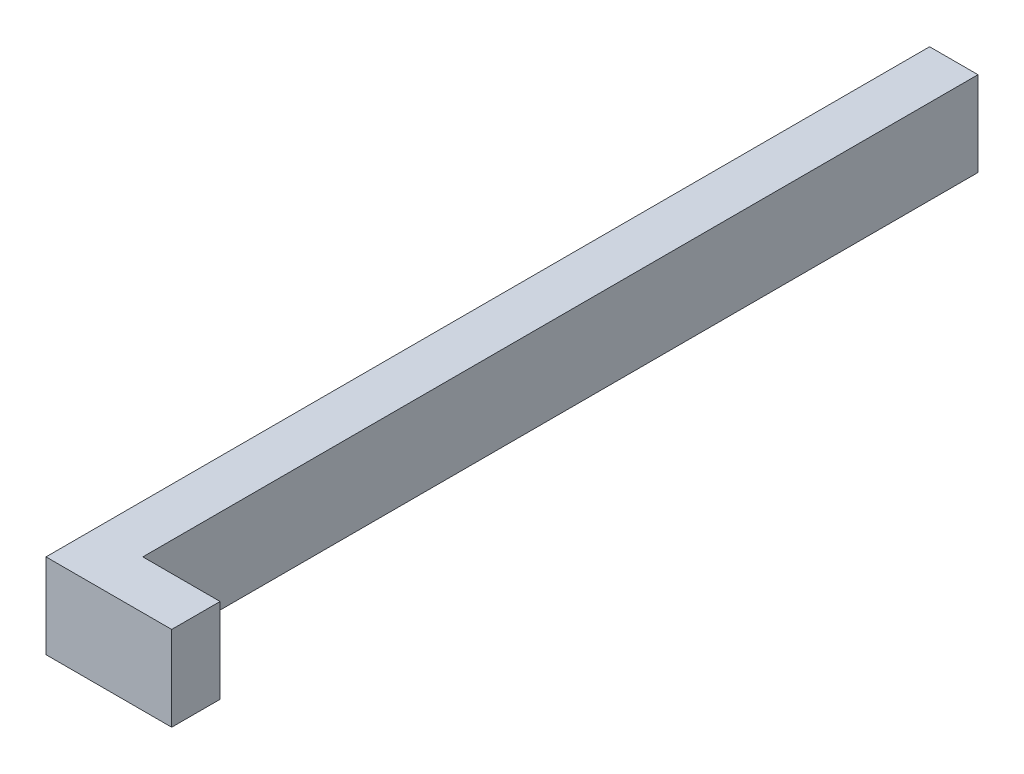
ISO-10303-21;
HEADER;
FILE_DESCRIPTION(('STEP AP214'),'2;1');
FILE_NAME('part.step','',(''),(''),'','','');
FILE_SCHEMA(('AUTOMOTIVE_DESIGN { 1 0 10303 214 1 1 1 1 }'));
ENDSEC;
DATA;
#1=APPLICATION_CONTEXT('core data for automotive mechanical design processes');
#2=APPLICATION_PROTOCOL_DEFINITION('international standard','automotive_design',2000,#1);
#3=PRODUCT_CONTEXT('',#1,'mechanical');
#4=PRODUCT('Part','Part','',(#3));
#5=PRODUCT_RELATED_PRODUCT_CATEGORY('part','',(#4));
#6=PRODUCT_DEFINITION_FORMATION('','',#4);
#7=PRODUCT_DEFINITION_CONTEXT('part definition',#1,'design');
#8=PRODUCT_DEFINITION('design','',#6,#7);
#9=PRODUCT_DEFINITION_SHAPE('','',#8);
#10=(LENGTH_UNIT() NAMED_UNIT(*) SI_UNIT(.MILLI.,.METRE.));
#11=(NAMED_UNIT(*) PLANE_ANGLE_UNIT() SI_UNIT($,.RADIAN.));
#12=(NAMED_UNIT(*) SI_UNIT($,.STERADIAN.) SOLID_ANGLE_UNIT());
#13=UNCERTAINTY_MEASURE_WITH_UNIT(LENGTH_MEASURE(1.E-05),#10,'distance_accuracy_value','');
#14=(GEOMETRIC_REPRESENTATION_CONTEXT(3) GLOBAL_UNCERTAINTY_ASSIGNED_CONTEXT((#13)) GLOBAL_UNIT_ASSIGNED_CONTEXT((#10,
#11,#12)) REPRESENTATION_CONTEXT('',''));
#15=CARTESIAN_POINT('',(0.,0.,0.));
#16=DIRECTION('',(0.,0.,1.));
#17=DIRECTION('',(1.,0.,0.));
#18=AXIS2_PLACEMENT_3D('',#15,#16,#17);
#19=CARTESIAN_POINT('',(-58.,8.5,-67.));
#20=DIRECTION('',(0.,0.,-1.));
#21=DIRECTION('',(-1.,0.,0.));
#22=AXIS2_PLACEMENT_3D('',#19,#20,#21);
#23=PLANE('',#22);
#24=DIRECTION('',(1.,0.,0.));
#25=VECTOR('',#24,1.);
#26=CARTESIAN_POINT('',(-58.,1.5,-67.));
#27=LINE('',#26,#25);
#28=CARTESIAN_POINT('',(-58.,1.5,-67.));
#29=VERTEX_POINT('',#28);
#30=CARTESIAN_POINT('',(-47.6158676579824,1.5,-67.));
#31=VERTEX_POINT('',#30);
#32=EDGE_CURVE('E142',#29,#31,#27,.T.);
#33=ORIENTED_EDGE('',*,*,#32,.T.);
#34=DIRECTION('',(0.,-1.,0.));
#35=VECTOR('',#34,1.);
#36=CARTESIAN_POINT('',(-47.6158676579824,8.5,-67.));
#37=LINE('',#36,#35);
#38=CARTESIAN_POINT('',(-47.6158676579824,8.5,-67.));
#39=VERTEX_POINT('',#38);
#40=EDGE_CURVE('E122',#39,#31,#37,.T.);
#41=ORIENTED_EDGE('',*,*,#40,.F.);
#42=DIRECTION('',(1.,0.,0.));
#43=VECTOR('',#42,1.);
#44=CARTESIAN_POINT('',(-58.,8.5,-67.));
#45=LINE('',#44,#43);
#46=CARTESIAN_POINT('',(-58.,8.5,-67.));
#47=VERTEX_POINT('',#46);
#48=EDGE_CURVE('E132',#47,#39,#45,.T.);
#49=ORIENTED_EDGE('',*,*,#48,.F.);
#50=DIRECTION('',(0.,-1.,0.));
#51=VECTOR('',#50,1.);
#52=CARTESIAN_POINT('',(-58.,8.5,-67.));
#53=LINE('',#52,#51);
#54=EDGE_CURVE('E125',#47,#29,#53,.T.);
#55=ORIENTED_EDGE('',*,*,#54,.T.);
#56=EDGE_LOOP('',(#33,#41,#49,#55));
#57=FACE_BOUND('',#56,.T.);
#58=ADVANCED_FACE('F45',(#57),#23,.F.);
#59=CARTESIAN_POINT('',(-47.6158676579824,8.5,-67.));
#60=DIRECTION('',(-1.,0.,0.));
#61=DIRECTION('',(0.,0.,1.));
#62=AXIS2_PLACEMENT_3D('',#59,#60,#61);
#63=PLANE('',#62);
#64=DIRECTION('',(0.,0.,-1.));
#65=VECTOR('',#64,1.);
#66=CARTESIAN_POINT('',(-47.6158676579824,1.5,-67.));
#67=LINE('',#66,#65);
#68=CARTESIAN_POINT('',(-47.6158676579824,1.5,-71.));
#69=VERTEX_POINT('',#68);
#70=EDGE_CURVE('E145',#31,#69,#67,.T.);
#71=ORIENTED_EDGE('',*,*,#70,.T.);
#72=DIRECTION('',(0.,-1.,0.));
#73=VECTOR('',#72,1.);
#74=CARTESIAN_POINT('',(-47.6158676579824,8.5,-71.));
#75=LINE('',#74,#73);
#76=CARTESIAN_POINT('',(-47.6158676579824,8.5,-71.));
#77=VERTEX_POINT('',#76);
#78=EDGE_CURVE('E114',#77,#69,#75,.T.);
#79=ORIENTED_EDGE('',*,*,#78,.F.);
#80=DIRECTION('',(0.,0.,-1.));
#81=VECTOR('',#80,1.);
#82=CARTESIAN_POINT('',(-47.6158676579824,8.5,-67.));
#83=LINE('',#82,#81);
#84=EDGE_CURVE('E138',#39,#77,#83,.T.);
#85=ORIENTED_EDGE('',*,*,#84,.F.);
#86=ORIENTED_EDGE('',*,*,#40,.T.);
#87=EDGE_LOOP('',(#71,#79,#85,#86));
#88=FACE_BOUND('',#87,.T.);
#89=ADVANCED_FACE('F152',(#88),#63,.F.);
#90=CARTESIAN_POINT('',(-47.6158676579824,8.5,-71.));
#91=DIRECTION('',(0.,0.,1.));
#92=DIRECTION('',(1.,0.,0.));
#93=AXIS2_PLACEMENT_3D('',#90,#91,#92);
#94=PLANE('',#93);
#95=DIRECTION('',(-1.,0.,0.));
#96=VECTOR('',#95,1.);
#97=CARTESIAN_POINT('',(-47.6158676579824,1.5,-71.));
#98=LINE('',#97,#96);
#99=CARTESIAN_POINT('',(-54.,1.5,-71.));
#100=VERTEX_POINT('',#99);
#101=EDGE_CURVE('E111',#69,#100,#98,.T.);
#102=ORIENTED_EDGE('',*,*,#101,.T.);
#103=DIRECTION('',(0.,-1.,0.));
#104=VECTOR('',#103,1.);
#105=CARTESIAN_POINT('',(-54.,8.5,-71.));
#106=LINE('',#105,#104);
#107=CARTESIAN_POINT('',(-54.,8.5,-71.));
#108=VERTEX_POINT('',#107);
#109=EDGE_CURVE('E109',#108,#100,#106,.T.);
#110=ORIENTED_EDGE('',*,*,#109,.F.);
#111=DIRECTION('',(-1.,0.,0.));
#112=VECTOR('',#111,1.);
#113=CARTESIAN_POINT('',(-47.6158676579824,8.5,-71.));
#114=LINE('',#113,#112);
#115=EDGE_CURVE('E116',#77,#108,#114,.T.);
#116=ORIENTED_EDGE('',*,*,#115,.F.);
#117=ORIENTED_EDGE('',*,*,#78,.T.);
#118=EDGE_LOOP('',(#102,#110,#116,#117));
#119=FACE_BOUND('',#118,.T.);
#120=ADVANCED_FACE('F148',(#119),#94,.F.);
#121=CARTESIAN_POINT('',(-54.,8.5,-71.));
#122=DIRECTION('',(-1.,0.,0.));
#123=DIRECTION('',(0.,0.,1.));
#124=AXIS2_PLACEMENT_3D('',#121,#122,#123);
#125=PLANE('',#124);
#126=DIRECTION('',(0.,0.,-1.));
#127=VECTOR('',#126,1.);
#128=CARTESIAN_POINT('',(-54.,1.5,-71.));
#129=LINE('',#128,#127);
#130=CARTESIAN_POINT('',(-54.,1.5,-140.));
#131=VERTEX_POINT('',#130);
#132=EDGE_CURVE('E95',#100,#131,#129,.T.);
#133=ORIENTED_EDGE('',*,*,#132,.T.);
#134=DIRECTION('',(0.,-1.,0.));
#135=VECTOR('',#134,1.);
#136=CARTESIAN_POINT('',(-54.,8.5,-140.));
#137=LINE('',#136,#135);
#138=CARTESIAN_POINT('',(-54.,8.5,-140.));
#139=VERTEX_POINT('',#138);
#140=EDGE_CURVE('E106',#139,#131,#137,.T.);
#141=ORIENTED_EDGE('',*,*,#140,.F.);
#142=DIRECTION('',(0.,0.,-1.));
#143=VECTOR('',#142,1.);
#144=CARTESIAN_POINT('',(-54.,8.5,-71.));
#145=LINE('',#144,#143);
#146=EDGE_CURVE('E61',#108,#139,#145,.T.);
#147=ORIENTED_EDGE('',*,*,#146,.F.);
#148=ORIENTED_EDGE('',*,*,#109,.T.);
#149=EDGE_LOOP('',(#133,#141,#147,#148));
#150=FACE_BOUND('',#149,.T.);
#151=ADVANCED_FACE('F105',(#150),#125,.F.);
#152=CARTESIAN_POINT('',(0.,8.5,0.));
#153=DIRECTION('',(0.,1.,0.));
#154=DIRECTION('',(0.,0.,1.));
#155=AXIS2_PLACEMENT_3D('',#152,#153,#154);
#156=PLANE('',#155);
#157=DIRECTION('',(-1.,0.,0.));
#158=VECTOR('',#157,1.);
#159=CARTESIAN_POINT('',(-54.,8.5,-140.));
#160=LINE('',#159,#158);
#161=CARTESIAN_POINT('',(-58.,8.5,-140.));
#162=VERTEX_POINT('',#161);
#163=EDGE_CURVE('E110',#139,#162,#160,.T.);
#164=ORIENTED_EDGE('',*,*,#163,.T.);
#165=DIRECTION('',(0.,0.,1.));
#166=VECTOR('',#165,1.);
#167=CARTESIAN_POINT('',(-58.,8.5,-140.));
#168=LINE('',#167,#166);
#169=EDGE_CURVE('E130',#162,#47,#168,.T.);
#170=ORIENTED_EDGE('',*,*,#169,.T.);
#171=ORIENTED_EDGE('',*,*,#48,.T.);
#172=ORIENTED_EDGE('',*,*,#84,.T.);
#173=ORIENTED_EDGE('',*,*,#115,.T.);
#174=ORIENTED_EDGE('',*,*,#146,.T.);
#175=EDGE_LOOP('',(#164,#170,#171,#172,#173,#174));
#176=FACE_BOUND('',#175,.T.);
#177=ADVANCED_FACE('F134',(#176),#156,.T.);
#178=CARTESIAN_POINT('',(-58.,8.5,-140.));
#179=DIRECTION('',(1.,0.,0.));
#180=DIRECTION('',(0.,0.,-1.));
#181=AXIS2_PLACEMENT_3D('',#178,#179,#180);
#182=PLANE('',#181);
#183=DIRECTION('',(0.,0.,1.));
#184=VECTOR('',#183,1.);
#185=CARTESIAN_POINT('',(-58.,1.5,-140.));
#186=LINE('',#185,#184);
#187=CARTESIAN_POINT('',(-58.,1.5,-140.));
#188=VERTEX_POINT('',#187);
#189=EDGE_CURVE('E98',#188,#29,#186,.T.);
#190=ORIENTED_EDGE('',*,*,#189,.T.);
#191=ORIENTED_EDGE('',*,*,#54,.F.);
#192=ORIENTED_EDGE('',*,*,#169,.F.);
#193=DIRECTION('',(0.,-1.,0.));
#194=VECTOR('',#193,1.);
#195=CARTESIAN_POINT('',(-58.,8.5,-140.));
#196=LINE('',#195,#194);
#197=EDGE_CURVE('E54',#162,#188,#196,.T.);
#198=ORIENTED_EDGE('',*,*,#197,.T.);
#199=EDGE_LOOP('',(#190,#191,#192,#198));
#200=FACE_BOUND('',#199,.T.);
#201=ADVANCED_FACE('F128',(#200),#182,.F.);
#202=CARTESIAN_POINT('',(140.,1.5,-140.));
#203=DIRECTION('',(0.,0.,1.));
#204=DIRECTION('',(1.,0.,0.));
#205=AXIS2_PLACEMENT_3D('',#202,#203,#204);
#206=PLANE('',#205);
#207=ORIENTED_EDGE('',*,*,#140,.T.);
#208=DIRECTION('',(-1.,0.,0.));
#209=VECTOR('',#208,1.);
#210=CARTESIAN_POINT('',(140.,1.5,-140.));
#211=LINE('',#210,#209);
#212=EDGE_CURVE('E11',#131,#188,#211,.T.);
#213=ORIENTED_EDGE('',*,*,#212,.T.);
#214=ORIENTED_EDGE('',*,*,#197,.F.);
#215=ORIENTED_EDGE('',*,*,#163,.F.);
#216=EDGE_LOOP('',(#207,#213,#214,#215));
#217=FACE_BOUND('',#216,.T.);
#218=ADVANCED_FACE('F47',(#217),#206,.F.);
#219=CARTESIAN_POINT('',(-144.515601083853,1.5,-140.));
#220=DIRECTION('',(0.,1.,0.));
#221=DIRECTION('',(0.,0.,1.));
#222=AXIS2_PLACEMENT_3D('',#219,#220,#221);
#223=PLANE('',#222);
#224=ORIENTED_EDGE('',*,*,#101,.F.);
#225=ORIENTED_EDGE('',*,*,#70,.F.);
#226=ORIENTED_EDGE('',*,*,#32,.F.);
#227=ORIENTED_EDGE('',*,*,#189,.F.);
#228=ORIENTED_EDGE('',*,*,#212,.F.);
#229=ORIENTED_EDGE('',*,*,#132,.F.);
#230=EDGE_LOOP('',(#224,#225,#226,#227,#228,#229));
#231=FACE_BOUND('',#230,.T.);
#232=ADVANCED_FACE('F94',(#231),#223,.F.);
#233=CLOSED_SHELL('',(#58,#89,#120,#151,#177,#201,#218,#232));
#234=MANIFOLD_SOLID_BREP('B2',#233);
#235=ADVANCED_BREP_SHAPE_REPRESENTATION('',(#18,#234),#14);
#236=SHAPE_DEFINITION_REPRESENTATION(#9,#235);
ENDSEC;
END-ISO-10303-21;
